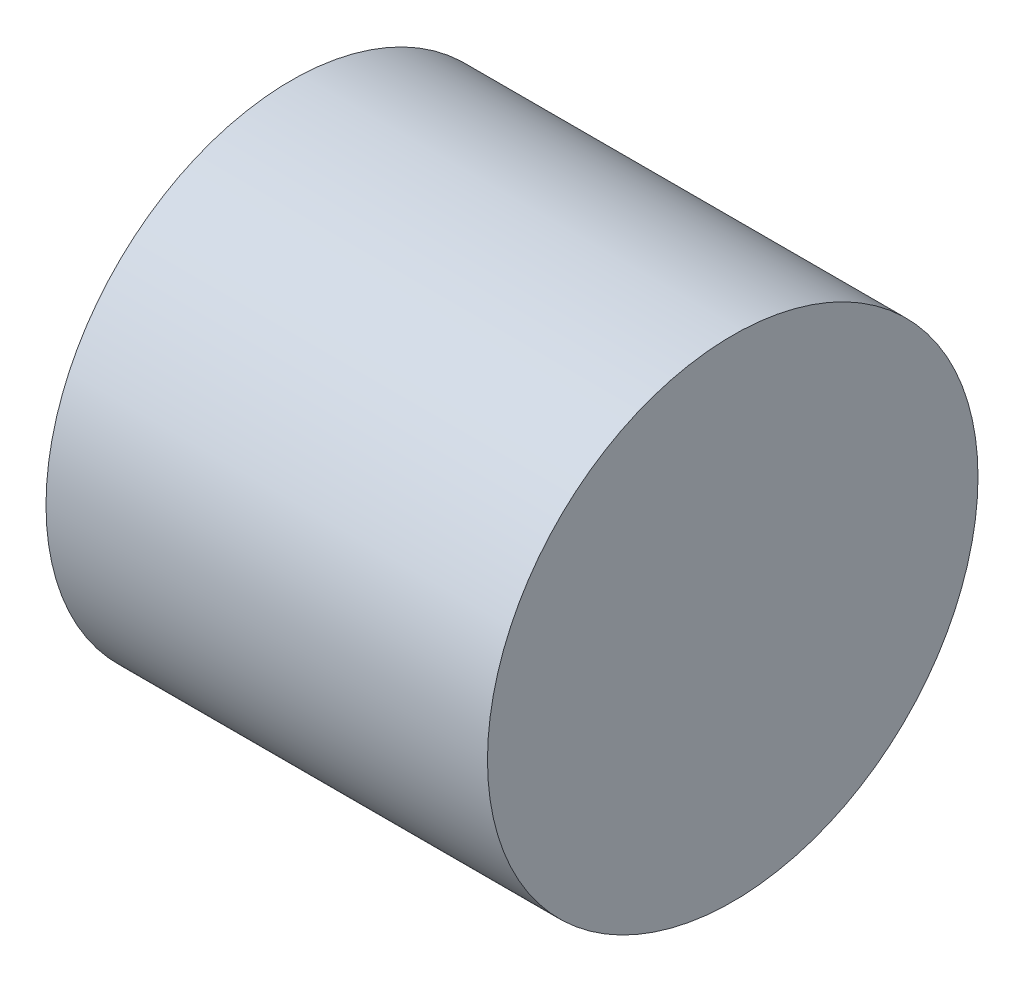
ISO-10303-21;
HEADER;
FILE_DESCRIPTION(('STEP AP214'),'2;1');
FILE_NAME('part.step','',(''),(''),'','','');
FILE_SCHEMA(('AUTOMOTIVE_DESIGN { 1 0 10303 214 1 1 1 1 }'));
ENDSEC;
DATA;
#1=APPLICATION_CONTEXT('core data for automotive mechanical design processes');
#2=APPLICATION_PROTOCOL_DEFINITION('international standard','automotive_design',2000,#1);
#3=PRODUCT_CONTEXT('',#1,'mechanical');
#4=PRODUCT('Part','Part','',(#3));
#5=PRODUCT_RELATED_PRODUCT_CATEGORY('part','',(#4));
#6=PRODUCT_DEFINITION_FORMATION('','',#4);
#7=PRODUCT_DEFINITION_CONTEXT('part definition',#1,'design');
#8=PRODUCT_DEFINITION('design','',#6,#7);
#9=PRODUCT_DEFINITION_SHAPE('','',#8);
#10=(LENGTH_UNIT() NAMED_UNIT(*) SI_UNIT(.MILLI.,.METRE.));
#11=(NAMED_UNIT(*) PLANE_ANGLE_UNIT() SI_UNIT($,.RADIAN.));
#12=(NAMED_UNIT(*) SI_UNIT($,.STERADIAN.) SOLID_ANGLE_UNIT());
#13=UNCERTAINTY_MEASURE_WITH_UNIT(LENGTH_MEASURE(1.E-05),#10,'distance_accuracy_value','');
#14=(GEOMETRIC_REPRESENTATION_CONTEXT(3) GLOBAL_UNCERTAINTY_ASSIGNED_CONTEXT((#13)) GLOBAL_UNIT_ASSIGNED_CONTEXT((#10,
#11,#12)) REPRESENTATION_CONTEXT('',''));
#15=CARTESIAN_POINT('',(0.,0.,0.));
#16=DIRECTION('',(0.,0.,1.));
#17=DIRECTION('',(1.,0.,0.));
#18=AXIS2_PLACEMENT_3D('',#15,#16,#17);
#19=CARTESIAN_POINT('',(115.,297.3,60.6));
#20=DIRECTION('',(1.,0.,0.));
#21=DIRECTION('',(0.,1.,0.));
#22=AXIS2_PLACEMENT_3D('',#19,#20,#21);
#23=PLANE('',#22);
#24=CARTESIAN_POINT('',(115.,297.3,60.6));
#25=DIRECTION('',(1.,0.,0.));
#26=DIRECTION('',(0.,0.,1.));
#27=AXIS2_PLACEMENT_3D('',#24,#25,#26);
#28=CIRCLE('',#27,25.);
#29=CARTESIAN_POINT('',(115.,297.3,85.6));
#30=VERTEX_POINT('',#29);
#31=EDGE_CURVE('E9',#30,#30,#28,.T.);
#32=ORIENTED_EDGE('',*,*,#31,.F.);
#33=EDGE_LOOP('',(#32));
#34=FACE_BOUND('',#33,.T.);
#35=ADVANCED_FACE('F14',(#34),#23,.F.);
#36=CARTESIAN_POINT('',(160.,297.3,60.6));
#37=DIRECTION('',(1.,0.,0.));
#38=DIRECTION('',(0.,1.,0.));
#39=AXIS2_PLACEMENT_3D('',#36,#37,#38);
#40=PLANE('',#39);
#41=CARTESIAN_POINT('',(160.,297.3,60.6));
#42=DIRECTION('',(1.,0.,0.));
#43=DIRECTION('',(0.,0.,1.));
#44=AXIS2_PLACEMENT_3D('',#41,#42,#43);
#45=CIRCLE('',#44,25.);
#46=CARTESIAN_POINT('',(160.,297.3,85.6));
#47=VERTEX_POINT('',#46);
#48=EDGE_CURVE('E21',#47,#47,#45,.T.);
#49=ORIENTED_EDGE('',*,*,#48,.T.);
#50=EDGE_LOOP('',(#49));
#51=FACE_BOUND('',#50,.T.);
#52=ADVANCED_FACE('F32',(#51),#40,.T.);
#53=CARTESIAN_POINT('',(115.,297.3,60.6));
#54=DIRECTION('',(1.,0.,0.));
#55=DIRECTION('',(0.,0.,1.));
#56=AXIS2_PLACEMENT_3D('',#53,#54,#55);
#57=CYLINDRICAL_SURFACE('',#56,25.);
#58=ORIENTED_EDGE('',*,*,#48,.F.);
#59=EDGE_LOOP('',(#58));
#60=FACE_BOUND('',#59,.T.);
#61=ORIENTED_EDGE('',*,*,#31,.T.);
#62=EDGE_LOOP('',(#61));
#63=FACE_BOUND('',#62,.T.);
#64=ADVANCED_FACE('F34',(#60,#63),#57,.T.);
#65=CLOSED_SHELL('',(#35,#52,#64));
#66=MANIFOLD_SOLID_BREP('B1',#65);
#67=ADVANCED_BREP_SHAPE_REPRESENTATION('',(#18,#66),#14);
#68=SHAPE_DEFINITION_REPRESENTATION(#9,#67);
ENDSEC;
END-ISO-10303-21;
